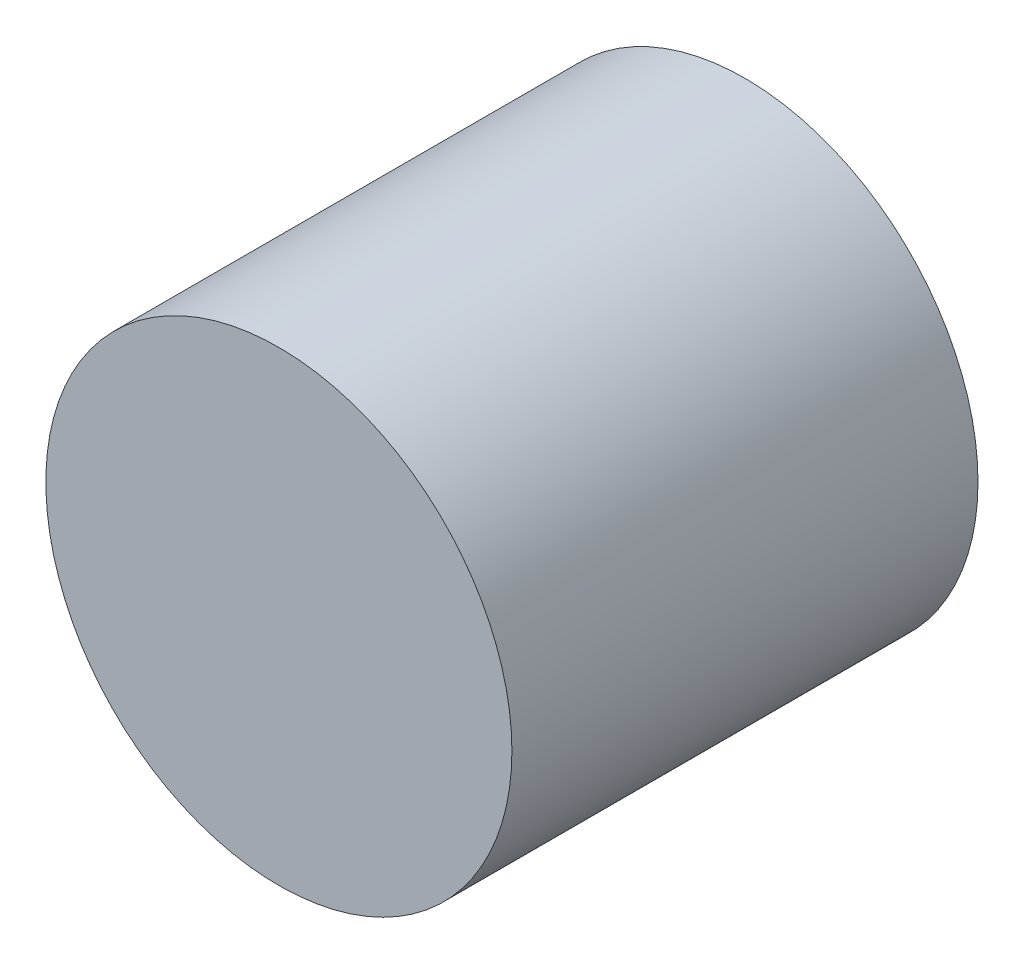
ISO-10303-21;
HEADER;
FILE_DESCRIPTION(('STEP AP214'),'2;1');
FILE_NAME('part.step','',(''),(''),'','','');
FILE_SCHEMA(('AUTOMOTIVE_DESIGN { 1 0 10303 214 1 1 1 1 }'));
ENDSEC;
DATA;
#1=APPLICATION_CONTEXT('core data for automotive mechanical design processes');
#2=APPLICATION_PROTOCOL_DEFINITION('international standard','automotive_design',2000,#1);
#3=PRODUCT_CONTEXT('',#1,'mechanical');
#4=PRODUCT('Part','Part','',(#3));
#5=PRODUCT_RELATED_PRODUCT_CATEGORY('part','',(#4));
#6=PRODUCT_DEFINITION_FORMATION('','',#4);
#7=PRODUCT_DEFINITION_CONTEXT('part definition',#1,'design');
#8=PRODUCT_DEFINITION('design','',#6,#7);
#9=PRODUCT_DEFINITION_SHAPE('','',#8);
#10=(LENGTH_UNIT() NAMED_UNIT(*) SI_UNIT(.MILLI.,.METRE.));
#11=(NAMED_UNIT(*) PLANE_ANGLE_UNIT() SI_UNIT($,.RADIAN.));
#12=(NAMED_UNIT(*) SI_UNIT($,.STERADIAN.) SOLID_ANGLE_UNIT());
#13=UNCERTAINTY_MEASURE_WITH_UNIT(LENGTH_MEASURE(1.E-05),#10,'distance_accuracy_value','');
#14=(GEOMETRIC_REPRESENTATION_CONTEXT(3) GLOBAL_UNCERTAINTY_ASSIGNED_CONTEXT((#13)) GLOBAL_UNIT_ASSIGNED_CONTEXT((#10,
#11,#12)) REPRESENTATION_CONTEXT('',''));
#15=CARTESIAN_POINT('',(0.,0.,0.));
#16=DIRECTION('',(0.,0.,1.));
#17=DIRECTION('',(1.,0.,0.));
#18=AXIS2_PLACEMENT_3D('',#15,#16,#17);
#19=CARTESIAN_POINT('',(0.,0.,15.875));
#20=DIRECTION('',(0.,0.,-1.));
#21=DIRECTION('',(-1.,0.,0.));
#22=AXIS2_PLACEMENT_3D('',#19,#20,#21);
#23=CYLINDRICAL_SURFACE('',#22,7.9375);
#24=CARTESIAN_POINT('',(0.,0.,15.875));
#25=DIRECTION('',(0.,0.,1.));
#26=DIRECTION('',(1.,0.,0.));
#27=AXIS2_PLACEMENT_3D('',#24,#25,#26);
#28=CIRCLE('',#27,7.9375);
#29=CARTESIAN_POINT('',(7.9375,0.,15.875));
#30=VERTEX_POINT('',#29);
#31=EDGE_CURVE('E10',#30,#30,#28,.T.);
#32=ORIENTED_EDGE('',*,*,#31,.F.);
#33=EDGE_LOOP('',(#32));
#34=FACE_BOUND('',#33,.T.);
#35=CARTESIAN_POINT('',(0.,0.,0.));
#36=DIRECTION('',(0.,0.,1.));
#37=DIRECTION('',(1.,0.,0.));
#38=AXIS2_PLACEMENT_3D('',#35,#36,#37);
#39=CIRCLE('',#38,7.9375);
#40=CARTESIAN_POINT('',(7.9375,0.,0.));
#41=VERTEX_POINT('',#40);
#42=EDGE_CURVE('E37',#41,#41,#39,.T.);
#43=ORIENTED_EDGE('',*,*,#42,.T.);
#44=EDGE_LOOP('',(#43));
#45=FACE_BOUND('',#44,.T.);
#46=ADVANCED_FACE('F40',(#34,#45),#23,.T.);
#47=CARTESIAN_POINT('',(0.,0.,15.875));
#48=DIRECTION('',(0.,0.,1.));
#49=DIRECTION('',(1.,0.,0.));
#50=AXIS2_PLACEMENT_3D('',#47,#48,#49);
#51=PLANE('',#50);
#52=ORIENTED_EDGE('',*,*,#31,.T.);
#53=EDGE_LOOP('',(#52));
#54=FACE_BOUND('',#53,.T.);
#55=ADVANCED_FACE('F55',(#54),#51,.T.);
#56=CARTESIAN_POINT('',(0.,0.,0.));
#57=DIRECTION('',(0.,0.,1.));
#58=DIRECTION('',(1.,0.,0.));
#59=AXIS2_PLACEMENT_3D('',#56,#57,#58);
#60=PLANE('',#59);
#61=ORIENTED_EDGE('',*,*,#42,.F.);
#62=EDGE_LOOP('',(#61));
#63=FACE_BOUND('',#62,.T.);
#64=ADVANCED_FACE('F49',(#63),#60,.F.);
#65=CLOSED_SHELL('',(#46,#55,#64));
#66=MANIFOLD_SOLID_BREP('B2',#65);
#67=ADVANCED_BREP_SHAPE_REPRESENTATION('',(#18,#66),#14);
#68=SHAPE_DEFINITION_REPRESENTATION(#9,#67);
ENDSEC;
END-ISO-10303-21;
